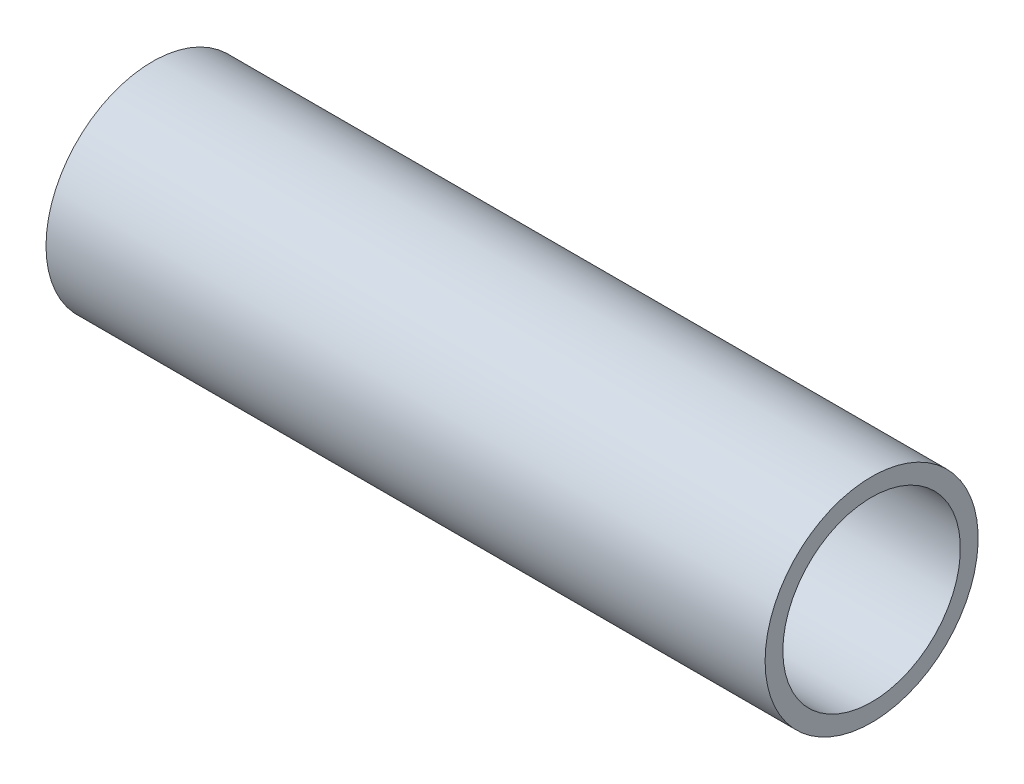
ISO-10303-21;
HEADER;
FILE_DESCRIPTION(('STEP AP214'),'2;1');
FILE_NAME('part.step','',(''),(''),'','','');
FILE_SCHEMA(('AUTOMOTIVE_DESIGN { 1 0 10303 214 1 1 1 1 }'));
ENDSEC;
DATA;
#1=APPLICATION_CONTEXT('core data for automotive mechanical design processes');
#2=APPLICATION_PROTOCOL_DEFINITION('international standard','automotive_design',2000,#1);
#3=PRODUCT_CONTEXT('',#1,'mechanical');
#4=PRODUCT('Part','Part','',(#3));
#5=PRODUCT_RELATED_PRODUCT_CATEGORY('part','',(#4));
#6=PRODUCT_DEFINITION_FORMATION('','',#4);
#7=PRODUCT_DEFINITION_CONTEXT('part definition',#1,'design');
#8=PRODUCT_DEFINITION('design','',#6,#7);
#9=PRODUCT_DEFINITION_SHAPE('','',#8);
#10=(LENGTH_UNIT() NAMED_UNIT(*) SI_UNIT(.MILLI.,.METRE.));
#11=(NAMED_UNIT(*) PLANE_ANGLE_UNIT() SI_UNIT($,.RADIAN.));
#12=(NAMED_UNIT(*) SI_UNIT($,.STERADIAN.) SOLID_ANGLE_UNIT());
#13=UNCERTAINTY_MEASURE_WITH_UNIT(LENGTH_MEASURE(1.E-05),#10,'distance_accuracy_value','');
#14=(GEOMETRIC_REPRESENTATION_CONTEXT(3) GLOBAL_UNCERTAINTY_ASSIGNED_CONTEXT((#13)) GLOBAL_UNIT_ASSIGNED_CONTEXT((#10,
#11,#12)) REPRESENTATION_CONTEXT('',''));
#15=CARTESIAN_POINT('',(0.,0.,0.));
#16=DIRECTION('',(0.,0.,1.));
#17=DIRECTION('',(1.,0.,0.));
#18=AXIS2_PLACEMENT_3D('',#15,#16,#17);
#19=CARTESIAN_POINT('',(32.146875,0.,0.));
#20=DIRECTION('',(-1.,0.,0.));
#21=DIRECTION('',(0.,0.,1.));
#22=AXIS2_PLACEMENT_3D('',#19,#20,#21);
#23=CYLINDRICAL_SURFACE('',#22,7.9375);
#24=CARTESIAN_POINT('',(-32.146875,0.,0.));
#25=DIRECTION('',(-1.,0.,0.));
#26=DIRECTION('',(0.,0.,1.));
#27=AXIS2_PLACEMENT_3D('',#24,#25,#26);
#28=CIRCLE('',#27,7.9375);
#29=CARTESIAN_POINT('',(-32.146875,0.,7.9375));
#30=VERTEX_POINT('',#29);
#31=EDGE_CURVE('E27',#30,#30,#28,.T.);
#32=ORIENTED_EDGE('',*,*,#31,.T.);
#33=EDGE_LOOP('',(#32));
#34=FACE_BOUND('',#33,.T.);
#35=CARTESIAN_POINT('',(32.146875,0.,0.));
#36=DIRECTION('',(-1.,0.,0.));
#37=DIRECTION('',(0.,0.,1.));
#38=AXIS2_PLACEMENT_3D('',#35,#36,#37);
#39=CIRCLE('',#38,7.9375);
#40=CARTESIAN_POINT('',(32.146875,0.,7.9375));
#41=VERTEX_POINT('',#40);
#42=EDGE_CURVE('E18',#41,#41,#39,.T.);
#43=ORIENTED_EDGE('',*,*,#42,.F.);
#44=EDGE_LOOP('',(#43));
#45=FACE_BOUND('',#44,.T.);
#46=ADVANCED_FACE('F15',(#34,#45),#23,.F.);
#47=CARTESIAN_POINT('',(32.146875,0.,0.));
#48=DIRECTION('',(1.,0.,0.));
#49=DIRECTION('',(0.,0.,-1.));
#50=AXIS2_PLACEMENT_3D('',#47,#48,#49);
#51=PLANE('',#50);
#52=ORIENTED_EDGE('',*,*,#42,.T.);
#53=EDGE_LOOP('',(#52));
#54=FACE_BOUND('',#53,.T.);
#55=CARTESIAN_POINT('',(32.146875,0.,0.));
#56=DIRECTION('',(-1.,0.,0.));
#57=DIRECTION('',(0.,0.,1.));
#58=AXIS2_PLACEMENT_3D('',#55,#56,#57);
#59=CIRCLE('',#58,9.525);
#60=CARTESIAN_POINT('',(32.146875,0.,9.525));
#61=VERTEX_POINT('',#60);
#62=EDGE_CURVE('E22',#61,#61,#59,.T.);
#63=ORIENTED_EDGE('',*,*,#62,.F.);
#64=EDGE_LOOP('',(#63));
#65=FACE_BOUND('',#64,.T.);
#66=ADVANCED_FACE('F35',(#54,#65),#51,.T.);
#67=CARTESIAN_POINT('',(-32.146875,0.,0.));
#68=DIRECTION('',(1.,0.,0.));
#69=DIRECTION('',(0.,0.,-1.));
#70=AXIS2_PLACEMENT_3D('',#67,#68,#69);
#71=PLANE('',#70);
#72=ORIENTED_EDGE('',*,*,#31,.F.);
#73=EDGE_LOOP('',(#72));
#74=FACE_BOUND('',#73,.T.);
#75=CARTESIAN_POINT('',(-32.146875,0.,0.));
#76=DIRECTION('',(-1.,0.,0.));
#77=DIRECTION('',(0.,0.,1.));
#78=AXIS2_PLACEMENT_3D('',#75,#76,#77);
#79=CIRCLE('',#78,9.525);
#80=CARTESIAN_POINT('',(-32.146875,0.,9.525));
#81=VERTEX_POINT('',#80);
#82=EDGE_CURVE('E10',#81,#81,#79,.F.);
#83=ORIENTED_EDGE('',*,*,#82,.F.);
#84=EDGE_LOOP('',(#83));
#85=FACE_BOUND('',#84,.T.);
#86=ADVANCED_FACE('F43',(#74,#85),#71,.F.);
#87=CARTESIAN_POINT('',(32.146875,0.,0.));
#88=DIRECTION('',(-1.,0.,0.));
#89=DIRECTION('',(0.,0.,1.));
#90=AXIS2_PLACEMENT_3D('',#87,#88,#89);
#91=CYLINDRICAL_SURFACE('',#90,9.525);
#92=ORIENTED_EDGE('',*,*,#82,.T.);
#93=EDGE_LOOP('',(#92));
#94=FACE_BOUND('',#93,.T.);
#95=ORIENTED_EDGE('',*,*,#62,.T.);
#96=EDGE_LOOP('',(#95));
#97=FACE_BOUND('',#96,.T.);
#98=ADVANCED_FACE('F44',(#94,#97),#91,.T.);
#99=CLOSED_SHELL('',(#46,#66,#86,#98));
#100=MANIFOLD_SOLID_BREP('B1',#99);
#101=ADVANCED_BREP_SHAPE_REPRESENTATION('',(#18,#100),#14);
#102=SHAPE_DEFINITION_REPRESENTATION(#9,#101);
ENDSEC;
END-ISO-10303-21;
